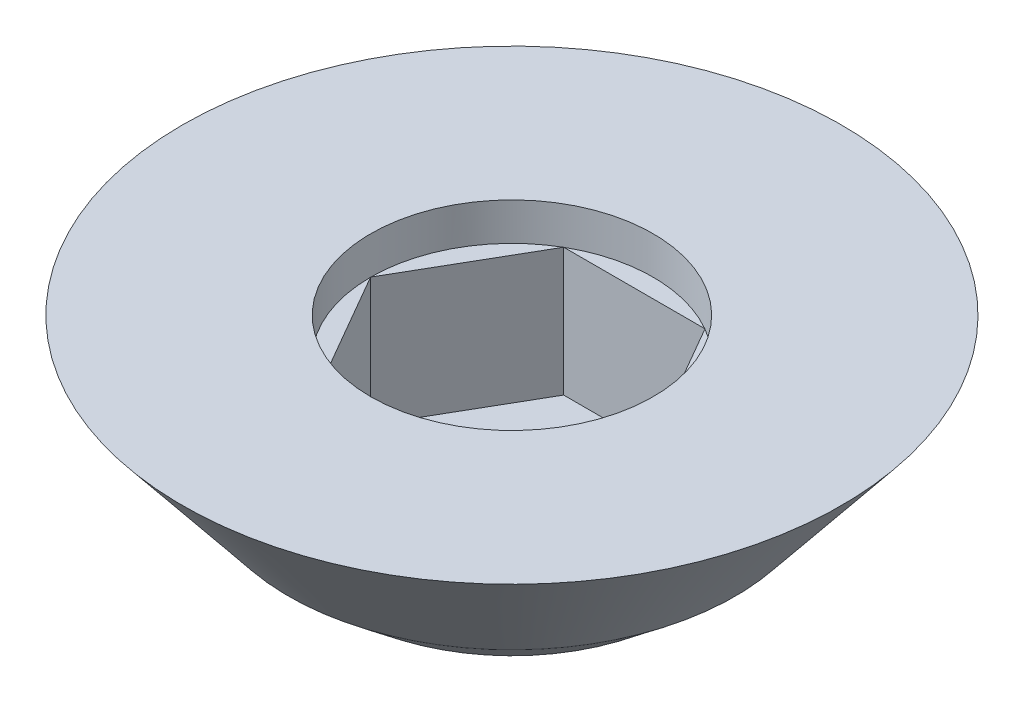
ISO-10303-21;
HEADER;
FILE_DESCRIPTION(('STEP AP214'),'2;1');
FILE_NAME('part.step','',(''),(''),'','','');
FILE_SCHEMA(('AUTOMOTIVE_DESIGN { 1 0 10303 214 1 1 1 1 }'));
ENDSEC;
DATA;
#1=APPLICATION_CONTEXT('core data for automotive mechanical design processes');
#2=APPLICATION_PROTOCOL_DEFINITION('international standard','automotive_design',2000,#1);
#3=PRODUCT_CONTEXT('',#1,'mechanical');
#4=PRODUCT('Part','Part','',(#3));
#5=PRODUCT_RELATED_PRODUCT_CATEGORY('part','',(#4));
#6=PRODUCT_DEFINITION_FORMATION('','',#4);
#7=PRODUCT_DEFINITION_CONTEXT('part definition',#1,'design');
#8=PRODUCT_DEFINITION('design','',#6,#7);
#9=PRODUCT_DEFINITION_SHAPE('','',#8);
#10=(LENGTH_UNIT() NAMED_UNIT(*) SI_UNIT(.MILLI.,.METRE.));
#11=(NAMED_UNIT(*) PLANE_ANGLE_UNIT() SI_UNIT($,.RADIAN.));
#12=(NAMED_UNIT(*) SI_UNIT($,.STERADIAN.) SOLID_ANGLE_UNIT());
#13=UNCERTAINTY_MEASURE_WITH_UNIT(LENGTH_MEASURE(1.E-05),#10,'distance_accuracy_value','');
#14=(GEOMETRIC_REPRESENTATION_CONTEXT(3) GLOBAL_UNCERTAINTY_ASSIGNED_CONTEXT((#13)) GLOBAL_UNIT_ASSIGNED_CONTEXT((#10,
#11,#12)) REPRESENTATION_CONTEXT('',''));
#15=CARTESIAN_POINT('',(0.,0.,0.));
#16=DIRECTION('',(0.,0.,1.));
#17=DIRECTION('',(1.,0.,0.));
#18=AXIS2_PLACEMENT_3D('',#15,#16,#17);
#19=CARTESIAN_POINT('',(0.,7.3,0.));
#20=DIRECTION('',(0.,1.,0.));
#21=DIRECTION('',(0.,0.,1.));
#22=AXIS2_PLACEMENT_3D('',#19,#20,#21);
#23=PLANE('',#22);
#24=DIRECTION('',(1.,0.,0.));
#25=VECTOR('',#24,1.);
#26=CARTESIAN_POINT('',(-3.75277674973257,7.3,6.5));
#27=LINE('',#26,#25);
#28=CARTESIAN_POINT('',(-3.74165738677394,7.3,6.5));
#29=VERTEX_POINT('',#28);
#30=CARTESIAN_POINT('',(3.74165738677394,7.3,6.5));
#31=VERTEX_POINT('',#30);
#32=EDGE_CURVE('E11',#29,#31,#27,.T.);
#33=ORIENTED_EDGE('',*,*,#32,.F.);
#34=CARTESIAN_POINT('',(0.,7.3,0.));
#35=DIRECTION('',(0.,1.,0.));
#36=DIRECTION('',(0.,0.,1.));
#37=AXIS2_PLACEMENT_3D('',#34,#35,#36);
#38=CIRCLE('',#37,7.5);
#39=EDGE_CURVE('E202',#29,#31,#38,.T.);
#40=ORIENTED_EDGE('',*,*,#39,.T.);
#41=EDGE_LOOP('',(#33,#40));
#42=FACE_BOUND('',#41,.T.);
#43=ADVANCED_FACE('F37',(#42),#23,.T.);
#44=DIRECTION('',(0.5,0.,-0.866025403784439));
#45=VECTOR('',#44,1.);
#46=CARTESIAN_POINT('',(3.75277674973257,7.3,6.5));
#47=LINE('',#46,#45);
#48=CARTESIAN_POINT('',(3.75833643121188,7.3,6.49037034920393));
#49=VERTEX_POINT('',#48);
#50=CARTESIAN_POINT('',(7.49999381798582,7.3,0.00962965079606866));
#51=VERTEX_POINT('',#50);
#52=EDGE_CURVE('E46',#49,#51,#47,.T.);
#53=ORIENTED_EDGE('',*,*,#52,.F.);
#54=EDGE_CURVE('E201',#49,#51,#38,.T.);
#55=ORIENTED_EDGE('',*,*,#54,.T.);
#56=EDGE_LOOP('',(#53,#55));
#57=FACE_BOUND('',#56,.T.);
#58=ADVANCED_FACE('F239',(#57),#23,.T.);
#59=DIRECTION('',(-0.5,0.,-0.866025403784438));
#60=VECTOR('',#59,1.);
#61=CARTESIAN_POINT('',(7.50555349946513,7.3,0.));
#62=LINE('',#61,#60);
#63=CARTESIAN_POINT('',(7.49999381798582,7.3,-0.00962965079607361));
#64=VERTEX_POINT('',#63);
#65=CARTESIAN_POINT('',(3.75833643121188,7.3,-6.49037034920393));
#66=VERTEX_POINT('',#65);
#67=EDGE_CURVE('E176',#64,#66,#62,.T.);
#68=ORIENTED_EDGE('',*,*,#67,.F.);
#69=EDGE_CURVE('E249',#64,#66,#38,.T.);
#70=ORIENTED_EDGE('',*,*,#69,.T.);
#71=EDGE_LOOP('',(#68,#70));
#72=FACE_BOUND('',#71,.T.);
#73=ADVANCED_FACE('F295',(#72),#23,.T.);
#74=DIRECTION('',(-1.,0.,0.));
#75=VECTOR('',#74,1.);
#76=CARTESIAN_POINT('',(3.75277674973256,7.3,-6.50000000000001));
#77=LINE('',#76,#75);
#78=CARTESIAN_POINT('',(3.74165738677393,7.3,-6.50000000000001));
#79=VERTEX_POINT('',#78);
#80=CARTESIAN_POINT('',(-3.74165738677393,7.3,-6.50000000000001));
#81=VERTEX_POINT('',#80);
#82=EDGE_CURVE('E181',#79,#81,#77,.T.);
#83=ORIENTED_EDGE('',*,*,#82,.F.);
#84=EDGE_CURVE('E253',#79,#81,#38,.T.);
#85=ORIENTED_EDGE('',*,*,#84,.T.);
#86=EDGE_LOOP('',(#83,#85));
#87=FACE_BOUND('',#86,.T.);
#88=ADVANCED_FACE('F288',(#87),#23,.T.);
#89=DIRECTION('',(-0.5,0.,0.866025403784439));
#90=VECTOR('',#89,1.);
#91=CARTESIAN_POINT('',(-3.75277674973257,7.3,-6.50000000000001));
#92=LINE('',#91,#90);
#93=CARTESIAN_POINT('',(-3.75833643121189,7.3,-6.49037034920393));
#94=VERTEX_POINT('',#93);
#95=CARTESIAN_POINT('',(-7.49999381798582,7.3,-0.0096296507960756));
#96=VERTEX_POINT('',#95);
#97=EDGE_CURVE('E184',#94,#96,#92,.T.);
#98=ORIENTED_EDGE('',*,*,#97,.F.);
#99=EDGE_CURVE('E262',#94,#96,#38,.T.);
#100=ORIENTED_EDGE('',*,*,#99,.T.);
#101=EDGE_LOOP('',(#98,#100));
#102=FACE_BOUND('',#101,.T.);
#103=ADVANCED_FACE('F277',(#102),#23,.T.);
#104=CARTESIAN_POINT('',(-9.,0.,0.));
#105=DIRECTION('',(0.,-1.,0.));
#106=DIRECTION('',(1.,0.,0.));
#107=AXIS2_PLACEMENT_3D('',#104,#105,#106);
#108=PLANE('',#107);
#109=CARTESIAN_POINT('',(0.,0.,0.));
#110=DIRECTION('',(0.,1.,0.));
#111=DIRECTION('',(-1.,0.,0.));
#112=AXIS2_PLACEMENT_3D('',#109,#110,#111);
#113=CIRCLE('',#112,9.);
#114=CARTESIAN_POINT('',(-9.,0.,0.));
#115=VERTEX_POINT('',#114);
#116=EDGE_CURVE('E41',#115,#115,#113,.T.);
#117=ORIENTED_EDGE('',*,*,#116,.F.);
#118=EDGE_LOOP('',(#117));
#119=FACE_BOUND('',#118,.T.);
#120=ADVANCED_FACE('F39',(#119),#108,.T.);
#121=CARTESIAN_POINT('',(0.,2.29428264472203,0.));
#122=DIRECTION('',(0.,1.,0.));
#123=DIRECTION('',(-1.,0.,0.));
#124=AXIS2_PLACEMENT_3D('',#121,#122,#123);
#125=CONICAL_SURFACE('',#124,11.850227939292,0.893046146040094);
#126=ORIENTED_EDGE('',*,*,#116,.T.);
#127=EDGE_LOOP('',(#126));
#128=FACE_BOUND('',#127,.T.);
#129=CARTESIAN_POINT('',(0.,2.29428264472203,0.));
#130=DIRECTION('',(0.,1.,0.));
#131=DIRECTION('',(-1.,0.,0.));
#132=AXIS2_PLACEMENT_3D('',#129,#130,#131);
#133=CIRCLE('',#132,11.850227939292);
#134=CARTESIAN_POINT('',(-11.850227939292,2.29428264472203,0.));
#135=VERTEX_POINT('',#134);
#136=EDGE_CURVE('E206',#135,#135,#133,.T.);
#137=ORIENTED_EDGE('',*,*,#136,.F.);
#138=EDGE_LOOP('',(#137));
#139=FACE_BOUND('',#138,.T.);
#140=ADVANCED_FACE('F293',(#128,#139),#125,.T.);
#141=CARTESIAN_POINT('',(0.,9.3,0.));
#142=DIRECTION('',(0.,1.,0.));
#143=DIRECTION('',(-1.,0.,0.));
#144=AXIS2_PLACEMENT_3D('',#141,#142,#143);
#145=CONICAL_SURFACE('',#144,17.5,0.678662490748312);
#146=ORIENTED_EDGE('',*,*,#136,.T.);
#147=EDGE_LOOP('',(#146));
#148=FACE_BOUND('',#147,.T.);
#149=CARTESIAN_POINT('',(0.,9.3,0.));
#150=DIRECTION('',(0.,1.,0.));
#151=DIRECTION('',(-1.,0.,0.));
#152=AXIS2_PLACEMENT_3D('',#149,#150,#151);
#153=CIRCLE('',#152,17.5);
#154=CARTESIAN_POINT('',(-17.5,9.3,0.));
#155=VERTEX_POINT('',#154);
#156=EDGE_CURVE('E200',#155,#155,#153,.T.);
#157=ORIENTED_EDGE('',*,*,#156,.F.);
#158=EDGE_LOOP('',(#157));
#159=FACE_BOUND('',#158,.T.);
#160=ADVANCED_FACE('F326',(#148,#159),#145,.T.);
#161=CARTESIAN_POINT('',(-17.5,9.3,0.));
#162=DIRECTION('',(0.,1.,0.));
#163=DIRECTION('',(-1.,0.,0.));
#164=AXIS2_PLACEMENT_3D('',#161,#162,#163);
#165=PLANE('',#164);
#166=CARTESIAN_POINT('',(0.,9.3,0.));
#167=DIRECTION('',(0.,1.,0.));
#168=DIRECTION('',(0.,0.,1.));
#169=AXIS2_PLACEMENT_3D('',#166,#167,#168);
#170=CIRCLE('',#169,7.5);
#171=CARTESIAN_POINT('',(0.,9.3,7.5));
#172=VERTEX_POINT('',#171);
#173=EDGE_CURVE('E188',#172,#172,#170,.T.);
#174=ORIENTED_EDGE('',*,*,#173,.F.);
#175=EDGE_LOOP('',(#174));
#176=FACE_BOUND('',#175,.T.);
#177=ORIENTED_EDGE('',*,*,#156,.T.);
#178=EDGE_LOOP('',(#177));
#179=FACE_BOUND('',#178,.T.);
#180=ADVANCED_FACE('F283',(#176,#179),#165,.T.);
#181=CARTESIAN_POINT('',(0.,7.3,0.));
#182=DIRECTION('',(0.,1.,0.));
#183=DIRECTION('',(0.,0.,1.));
#184=AXIS2_PLACEMENT_3D('',#181,#182,#183);
#185=CYLINDRICAL_SURFACE('',#184,7.5);
#186=EDGE_CURVE('E198',#31,#49,#38,.T.);
#187=ORIENTED_EDGE('',*,*,#186,.F.);
#188=ORIENTED_EDGE('',*,*,#39,.F.);
#189=CARTESIAN_POINT('',(-3.75833643121188,7.3,6.49037034920393));
#190=VERTEX_POINT('',#189);
#191=EDGE_CURVE('E219',#190,#29,#38,.T.);
#192=ORIENTED_EDGE('',*,*,#191,.F.);
#193=CARTESIAN_POINT('',(-7.49999381798582,7.3,0.0096296507960756));
#194=VERTEX_POINT('',#193);
#195=EDGE_CURVE('E224',#194,#190,#38,.T.);
#196=ORIENTED_EDGE('',*,*,#195,.F.);
#197=EDGE_CURVE('E225',#96,#194,#38,.T.);
#198=ORIENTED_EDGE('',*,*,#197,.F.);
#199=ORIENTED_EDGE('',*,*,#99,.F.);
#200=EDGE_CURVE('E258',#81,#94,#38,.T.);
#201=ORIENTED_EDGE('',*,*,#200,.F.);
#202=ORIENTED_EDGE('',*,*,#84,.F.);
#203=EDGE_CURVE('E251',#66,#79,#38,.T.);
#204=ORIENTED_EDGE('',*,*,#203,.F.);
#205=ORIENTED_EDGE('',*,*,#69,.F.);
#206=EDGE_CURVE('E247',#51,#64,#38,.T.);
#207=ORIENTED_EDGE('',*,*,#206,.F.);
#208=ORIENTED_EDGE('',*,*,#54,.F.);
#209=EDGE_LOOP('',(#187,#188,#192,#196,#198,#199,#201,#202,#204,#205,#207,#208));
#210=FACE_BOUND('',#209,.T.);
#211=ORIENTED_EDGE('',*,*,#173,.T.);
#212=EDGE_LOOP('',(#211));
#213=FACE_BOUND('',#212,.T.);
#214=ADVANCED_FACE('F230',(#210,#213),#185,.F.);
#215=DIRECTION('',(0.5,0.,0.866025403784439));
#216=VECTOR('',#215,1.);
#217=CARTESIAN_POINT('',(-7.50555349946514,7.3,0.));
#218=LINE('',#217,#216);
#219=EDGE_CURVE('E159',#194,#190,#218,.T.);
#220=ORIENTED_EDGE('',*,*,#219,.F.);
#221=ORIENTED_EDGE('',*,*,#195,.T.);
#222=EDGE_LOOP('',(#220,#221));
#223=FACE_BOUND('',#222,.T.);
#224=ADVANCED_FACE('F274',(#223),#23,.T.);
#225=CARTESIAN_POINT('',(0.,7.3,0.));
#226=DIRECTION('',(0.,1.,0.));
#227=DIRECTION('',(0.,0.,1.));
#228=AXIS2_PLACEMENT_3D('',#225,#226,#227);
#229=PLANE('',#228);
#230=ORIENTED_EDGE('',*,*,#186,.T.);
#231=CARTESIAN_POINT('',(3.75277674973257,7.3,6.5));
#232=VERTEX_POINT('',#231);
#233=EDGE_CURVE('E169',#232,#49,#47,.T.);
#234=ORIENTED_EDGE('',*,*,#233,.F.);
#235=EDGE_CURVE('E49',#31,#232,#27,.T.);
#236=ORIENTED_EDGE('',*,*,#235,.F.);
#237=EDGE_LOOP('',(#230,#234,#236));
#238=FACE_BOUND('',#237,.T.);
#239=ADVANCED_FACE('F235',(#238),#229,.F.);
#240=ORIENTED_EDGE('',*,*,#206,.T.);
#241=CARTESIAN_POINT('',(7.50555349946513,7.3,0.));
#242=VERTEX_POINT('',#241);
#243=EDGE_CURVE('E172',#242,#64,#62,.T.);
#244=ORIENTED_EDGE('',*,*,#243,.F.);
#245=EDGE_CURVE('E168',#51,#242,#47,.T.);
#246=ORIENTED_EDGE('',*,*,#245,.F.);
#247=EDGE_LOOP('',(#240,#244,#246));
#248=FACE_BOUND('',#247,.T.);
#249=ADVANCED_FACE('F246',(#248),#229,.F.);
#250=ORIENTED_EDGE('',*,*,#203,.T.);
#251=CARTESIAN_POINT('',(3.75277674973256,7.3,-6.50000000000001));
#252=VERTEX_POINT('',#251);
#253=EDGE_CURVE('E177',#252,#79,#77,.T.);
#254=ORIENTED_EDGE('',*,*,#253,.F.);
#255=EDGE_CURVE('E171',#66,#252,#62,.T.);
#256=ORIENTED_EDGE('',*,*,#255,.F.);
#257=EDGE_LOOP('',(#250,#254,#256));
#258=FACE_BOUND('',#257,.T.);
#259=ADVANCED_FACE('F304',(#258),#229,.F.);
#260=ORIENTED_EDGE('',*,*,#200,.T.);
#261=CARTESIAN_POINT('',(-3.75277674973257,7.3,-6.50000000000001));
#262=VERTEX_POINT('',#261);
#263=EDGE_CURVE('E182',#262,#94,#92,.T.);
#264=ORIENTED_EDGE('',*,*,#263,.F.);
#265=EDGE_CURVE('E175',#81,#262,#77,.T.);
#266=ORIENTED_EDGE('',*,*,#265,.F.);
#267=EDGE_LOOP('',(#260,#264,#266));
#268=FACE_BOUND('',#267,.T.);
#269=ADVANCED_FACE('F299',(#268),#229,.F.);
#270=ORIENTED_EDGE('',*,*,#197,.T.);
#271=CARTESIAN_POINT('',(-7.50555349946514,7.3,0.));
#272=VERTEX_POINT('',#271);
#273=EDGE_CURVE('E56',#272,#194,#218,.T.);
#274=ORIENTED_EDGE('',*,*,#273,.F.);
#275=EDGE_CURVE('E180',#96,#272,#92,.T.);
#276=ORIENTED_EDGE('',*,*,#275,.F.);
#277=EDGE_LOOP('',(#270,#274,#276));
#278=FACE_BOUND('',#277,.T.);
#279=ADVANCED_FACE('F272',(#278),#229,.F.);
#280=CARTESIAN_POINT('',(-3.75277674973257,0.500000000000001,6.5));
#281=DIRECTION('',(0.,0.,1.));
#282=DIRECTION('',(1.,0.,0.));
#283=AXIS2_PLACEMENT_3D('',#280,#281,#282);
#284=PLANE('',#283);
#285=CARTESIAN_POINT('',(-3.75277674973257,7.3,6.5));
#286=VERTEX_POINT('',#285);
#287=EDGE_CURVE('E48',#286,#29,#27,.T.);
#288=ORIENTED_EDGE('',*,*,#287,.T.);
#289=ORIENTED_EDGE('',*,*,#32,.T.);
#290=ORIENTED_EDGE('',*,*,#235,.T.);
#291=DIRECTION('',(0.,1.,0.));
#292=VECTOR('',#291,1.);
#293=CARTESIAN_POINT('',(3.75277674973257,0.500000000000001,6.5));
#294=LINE('',#293,#292);
#295=CARTESIAN_POINT('',(3.75277674973257,0.500000000000001,6.5));
#296=VERTEX_POINT('',#295);
#297=EDGE_CURVE('E131',#296,#232,#294,.T.);
#298=ORIENTED_EDGE('',*,*,#297,.F.);
#299=DIRECTION('',(1.,0.,0.));
#300=VECTOR('',#299,1.);
#301=CARTESIAN_POINT('',(-3.75277674973257,0.500000000000001,6.5));
#302=LINE('',#301,#300);
#303=CARTESIAN_POINT('',(-3.75277674973257,0.500000000000001,6.5));
#304=VERTEX_POINT('',#303);
#305=EDGE_CURVE('E137',#304,#296,#302,.T.);
#306=ORIENTED_EDGE('',*,*,#305,.F.);
#307=DIRECTION('',(0.,1.,0.));
#308=VECTOR('',#307,1.);
#309=CARTESIAN_POINT('',(-3.75277674973257,0.500000000000001,6.5));
#310=LINE('',#309,#308);
#311=EDGE_CURVE('E186',#304,#286,#310,.T.);
#312=ORIENTED_EDGE('',*,*,#311,.T.);
#313=EDGE_LOOP('',(#288,#289,#290,#298,#306,#312));
#314=FACE_BOUND('',#313,.T.);
#315=ADVANCED_FACE('F134',(#314),#284,.F.);
#316=CARTESIAN_POINT('',(-7.50555349946514,0.500000000000001,0.));
#317=DIRECTION('',(-0.866025403784439,0.,0.5));
#318=DIRECTION('',(0.5,0.,0.866025403784439));
#319=AXIS2_PLACEMENT_3D('',#316,#317,#318);
#320=PLANE('',#319);
#321=ORIENTED_EDGE('',*,*,#273,.T.);
#322=ORIENTED_EDGE('',*,*,#219,.T.);
#323=EDGE_CURVE('E64',#190,#286,#218,.T.);
#324=ORIENTED_EDGE('',*,*,#323,.T.);
#325=ORIENTED_EDGE('',*,*,#311,.F.);
#326=DIRECTION('',(0.5,0.,0.866025403784439));
#327=VECTOR('',#326,1.);
#328=CARTESIAN_POINT('',(-7.50555349946514,0.500000000000001,0.));
#329=LINE('',#328,#327);
#330=CARTESIAN_POINT('',(-7.50555349946514,0.500000000000001,0.));
#331=VERTEX_POINT('',#330);
#332=EDGE_CURVE('E143',#331,#304,#329,.T.);
#333=ORIENTED_EDGE('',*,*,#332,.F.);
#334=DIRECTION('',(0.,1.,0.));
#335=VECTOR('',#334,1.);
#336=CARTESIAN_POINT('',(-7.50555349946514,0.500000000000001,0.));
#337=LINE('',#336,#335);
#338=EDGE_CURVE('E189',#331,#272,#337,.T.);
#339=ORIENTED_EDGE('',*,*,#338,.T.);
#340=EDGE_LOOP('',(#321,#322,#324,#325,#333,#339));
#341=FACE_BOUND('',#340,.T.);
#342=ADVANCED_FACE('F216',(#341),#320,.F.);
#343=CARTESIAN_POINT('',(-3.75277674973257,0.500000000000001,-6.50000000000001));
#344=DIRECTION('',(-0.866025403784439,0.,-0.5));
#345=DIRECTION('',(-0.5,0.,0.866025403784439));
#346=AXIS2_PLACEMENT_3D('',#343,#344,#345);
#347=PLANE('',#346);
#348=ORIENTED_EDGE('',*,*,#263,.T.);
#349=ORIENTED_EDGE('',*,*,#97,.T.);
#350=ORIENTED_EDGE('',*,*,#275,.T.);
#351=ORIENTED_EDGE('',*,*,#338,.F.);
#352=DIRECTION('',(-0.5,0.,0.866025403784439));
#353=VECTOR('',#352,1.);
#354=CARTESIAN_POINT('',(-3.75277674973257,0.500000000000001,-6.50000000000001));
#355=LINE('',#354,#353);
#356=CARTESIAN_POINT('',(-3.75277674973257,0.500000000000001,-6.50000000000001));
#357=VERTEX_POINT('',#356);
#358=EDGE_CURVE('E165',#357,#331,#355,.T.);
#359=ORIENTED_EDGE('',*,*,#358,.F.);
#360=DIRECTION('',(0.,1.,0.));
#361=VECTOR('',#360,1.);
#362=CARTESIAN_POINT('',(-3.75277674973257,0.500000000000001,-6.50000000000001));
#363=LINE('',#362,#361);
#364=EDGE_CURVE('E191',#357,#262,#363,.T.);
#365=ORIENTED_EDGE('',*,*,#364,.T.);
#366=EDGE_LOOP('',(#348,#349,#350,#351,#359,#365));
#367=FACE_BOUND('',#366,.T.);
#368=ADVANCED_FACE('F297',(#367),#347,.F.);
#369=CARTESIAN_POINT('',(3.75277674973256,0.500000000000001,-6.50000000000001));
#370=DIRECTION('',(0.,0.,-1.));
#371=DIRECTION('',(-1.,0.,0.));
#372=AXIS2_PLACEMENT_3D('',#369,#370,#371);
#373=PLANE('',#372);
#374=ORIENTED_EDGE('',*,*,#253,.T.);
#375=ORIENTED_EDGE('',*,*,#82,.T.);
#376=ORIENTED_EDGE('',*,*,#265,.T.);
#377=ORIENTED_EDGE('',*,*,#364,.F.);
#378=DIRECTION('',(-1.,0.,0.));
#379=VECTOR('',#378,1.);
#380=CARTESIAN_POINT('',(3.75277674973256,0.500000000000001,-6.50000000000001));
#381=LINE('',#380,#379);
#382=CARTESIAN_POINT('',(3.75277674973256,0.500000000000001,-6.50000000000001));
#383=VERTEX_POINT('',#382);
#384=EDGE_CURVE('E162',#383,#357,#381,.T.);
#385=ORIENTED_EDGE('',*,*,#384,.F.);
#386=DIRECTION('',(0.,1.,0.));
#387=VECTOR('',#386,1.);
#388=CARTESIAN_POINT('',(3.75277674973256,0.500000000000001,-6.50000000000001));
#389=LINE('',#388,#387);
#390=EDGE_CURVE('E194',#383,#252,#389,.T.);
#391=ORIENTED_EDGE('',*,*,#390,.T.);
#392=EDGE_LOOP('',(#374,#375,#376,#377,#385,#391));
#393=FACE_BOUND('',#392,.T.);
#394=ADVANCED_FACE('F302',(#393),#373,.F.);
#395=CARTESIAN_POINT('',(7.50555349946513,0.500000000000001,0.));
#396=DIRECTION('',(0.866025403784438,0.,-0.5));
#397=DIRECTION('',(-0.5,0.,-0.866025403784439));
#398=AXIS2_PLACEMENT_3D('',#395,#396,#397);
#399=PLANE('',#398);
#400=ORIENTED_EDGE('',*,*,#243,.T.);
#401=ORIENTED_EDGE('',*,*,#67,.T.);
#402=ORIENTED_EDGE('',*,*,#255,.T.);
#403=ORIENTED_EDGE('',*,*,#390,.F.);
#404=DIRECTION('',(-0.5,0.,-0.866025403784438));
#405=VECTOR('',#404,1.);
#406=CARTESIAN_POINT('',(7.50555349946513,0.500000000000001,0.));
#407=LINE('',#406,#405);
#408=CARTESIAN_POINT('',(7.50555349946513,0.500000000000001,0.));
#409=VERTEX_POINT('',#408);
#410=EDGE_CURVE('E152',#409,#383,#407,.T.);
#411=ORIENTED_EDGE('',*,*,#410,.F.);
#412=DIRECTION('',(0.,1.,0.));
#413=VECTOR('',#412,1.);
#414=CARTESIAN_POINT('',(7.50555349946513,0.500000000000001,0.));
#415=LINE('',#414,#413);
#416=EDGE_CURVE('E142',#409,#242,#415,.T.);
#417=ORIENTED_EDGE('',*,*,#416,.T.);
#418=EDGE_LOOP('',(#400,#401,#402,#403,#411,#417));
#419=FACE_BOUND('',#418,.T.);
#420=ADVANCED_FACE('F244',(#419),#399,.F.);
#421=CARTESIAN_POINT('',(3.75277674973257,0.500000000000001,6.5));
#422=DIRECTION('',(0.866025403784439,0.,0.5));
#423=DIRECTION('',(0.5,0.,-0.866025403784439));
#424=AXIS2_PLACEMENT_3D('',#421,#422,#423);
#425=PLANE('',#424);
#426=ORIENTED_EDGE('',*,*,#233,.T.);
#427=ORIENTED_EDGE('',*,*,#52,.T.);
#428=ORIENTED_EDGE('',*,*,#245,.T.);
#429=ORIENTED_EDGE('',*,*,#416,.F.);
#430=DIRECTION('',(0.5,0.,-0.866025403784439));
#431=VECTOR('',#430,1.);
#432=CARTESIAN_POINT('',(3.75277674973257,0.500000000000001,6.5));
#433=LINE('',#432,#431);
#434=EDGE_CURVE('E146',#296,#409,#433,.T.);
#435=ORIENTED_EDGE('',*,*,#434,.F.);
#436=ORIENTED_EDGE('',*,*,#297,.T.);
#437=EDGE_LOOP('',(#426,#427,#428,#429,#435,#436));
#438=FACE_BOUND('',#437,.T.);
#439=ADVANCED_FACE('F147',(#438),#425,.F.);
#440=CARTESIAN_POINT('',(0.,0.500000000000001,0.));
#441=DIRECTION('',(0.,1.,0.));
#442=DIRECTION('',(0.,0.,1.));
#443=AXIS2_PLACEMENT_3D('',#440,#441,#442);
#444=PLANE('',#443);
#445=ORIENTED_EDGE('',*,*,#305,.T.);
#446=ORIENTED_EDGE('',*,*,#434,.T.);
#447=ORIENTED_EDGE('',*,*,#410,.T.);
#448=ORIENTED_EDGE('',*,*,#384,.T.);
#449=ORIENTED_EDGE('',*,*,#358,.T.);
#450=ORIENTED_EDGE('',*,*,#332,.T.);
#451=EDGE_LOOP('',(#445,#446,#447,#448,#449,#450));
#452=FACE_BOUND('',#451,.T.);
#453=ADVANCED_FACE('F154',(#452),#444,.T.);
#454=ORIENTED_EDGE('',*,*,#191,.T.);
#455=ORIENTED_EDGE('',*,*,#287,.F.);
#456=ORIENTED_EDGE('',*,*,#323,.F.);
#457=EDGE_LOOP('',(#454,#455,#456));
#458=FACE_BOUND('',#457,.T.);
#459=ADVANCED_FACE('F218',(#458),#229,.F.);
#460=CLOSED_SHELL('',(#43,#58,#73,#88,#103,#120,#140,#160,#180,#214,#224,#239,#249,#259,#269,
#279,#315,#342,#368,#394,#420,#439,#453,#459));
#461=MANIFOLD_SOLID_BREP('B2',#460);
#462=ADVANCED_BREP_SHAPE_REPRESENTATION('',(#18,#461),#14);
#463=SHAPE_DEFINITION_REPRESENTATION(#9,#462);
ENDSEC;
END-ISO-10303-21;
